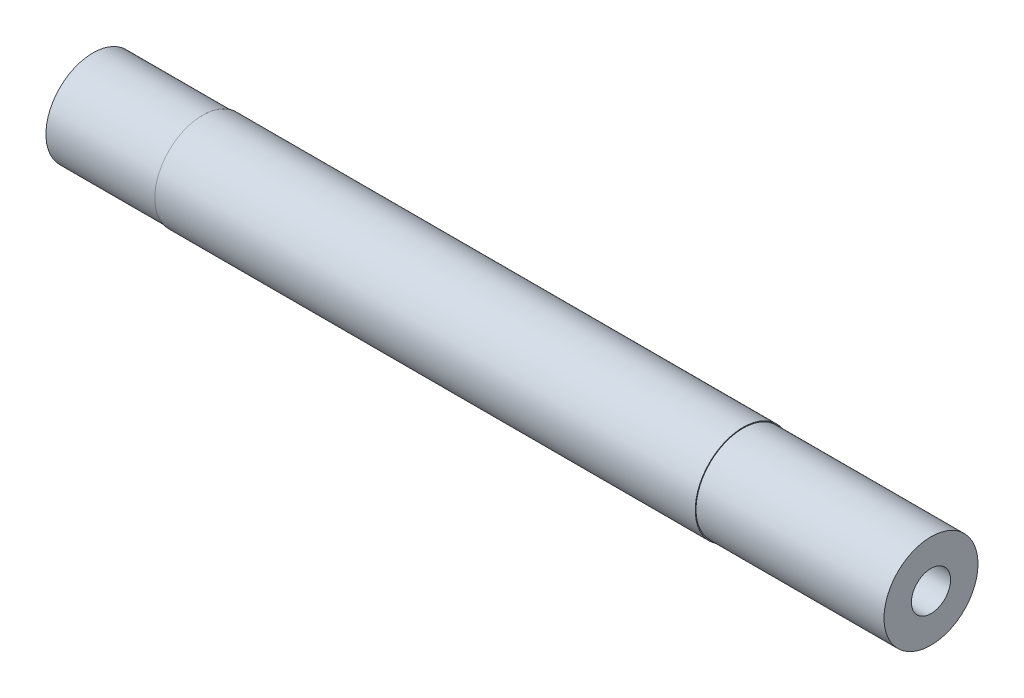
ISO-10303-21;
HEADER;
FILE_DESCRIPTION(('STEP AP214'),'2;1');
FILE_NAME('part.step','',(''),(''),'','','');
FILE_SCHEMA(('AUTOMOTIVE_DESIGN { 1 0 10303 214 1 1 1 1 }'));
ENDSEC;
DATA;
#1=APPLICATION_CONTEXT('core data for automotive mechanical design processes');
#2=APPLICATION_PROTOCOL_DEFINITION('international standard','automotive_design',2000,#1);
#3=PRODUCT_CONTEXT('',#1,'mechanical');
#4=PRODUCT('Part','Part','',(#3));
#5=PRODUCT_RELATED_PRODUCT_CATEGORY('part','',(#4));
#6=PRODUCT_DEFINITION_FORMATION('','',#4);
#7=PRODUCT_DEFINITION_CONTEXT('part definition',#1,'design');
#8=PRODUCT_DEFINITION('design','',#6,#7);
#9=PRODUCT_DEFINITION_SHAPE('','',#8);
#10=(LENGTH_UNIT() NAMED_UNIT(*) SI_UNIT(.MILLI.,.METRE.));
#11=(NAMED_UNIT(*) PLANE_ANGLE_UNIT() SI_UNIT($,.RADIAN.));
#12=(NAMED_UNIT(*) SI_UNIT($,.STERADIAN.) SOLID_ANGLE_UNIT());
#13=UNCERTAINTY_MEASURE_WITH_UNIT(LENGTH_MEASURE(1.E-05),#10,'distance_accuracy_value','');
#14=(GEOMETRIC_REPRESENTATION_CONTEXT(3) GLOBAL_UNCERTAINTY_ASSIGNED_CONTEXT((#13)) GLOBAL_UNIT_ASSIGNED_CONTEXT((#10,
#11,#12)) REPRESENTATION_CONTEXT('',''));
#15=CARTESIAN_POINT('',(0.,0.,0.));
#16=DIRECTION('',(0.,0.,1.));
#17=DIRECTION('',(1.,0.,0.));
#18=AXIS2_PLACEMENT_3D('',#15,#16,#17);
#19=CARTESIAN_POINT('',(0.,0.,0.));
#20=DIRECTION('',(-1.,0.,0.));
#21=DIRECTION('',(0.,0.,1.));
#22=AXIS2_PLACEMENT_3D('',#19,#20,#21);
#23=PLANE('',#22);
#24=CARTESIAN_POINT('',(0.,0.,0.));
#25=DIRECTION('',(1.,0.,0.));
#26=DIRECTION('',(0.,0.,-1.));
#27=AXIS2_PLACEMENT_3D('',#24,#25,#26);
#28=CIRCLE('',#27,3.);
#29=CARTESIAN_POINT('',(0.,0.,-3.));
#30=VERTEX_POINT('',#29);
#31=EDGE_CURVE('E10',#30,#30,#28,.T.);
#32=ORIENTED_EDGE('',*,*,#31,.F.);
#33=EDGE_LOOP('',(#32));
#34=FACE_BOUND('',#33,.T.);
#35=ADVANCED_FACE('F35',(#34),#23,.T.);
#36=CARTESIAN_POINT('',(0.,0.,0.));
#37=DIRECTION('',(1.,0.,0.));
#38=DIRECTION('',(0.,0.,-1.));
#39=AXIS2_PLACEMENT_3D('',#36,#37,#38);
#40=CYLINDRICAL_SURFACE('',#39,3.);
#41=ORIENTED_EDGE('',*,*,#31,.T.);
#42=EDGE_LOOP('',(#41));
#43=FACE_BOUND('',#42,.T.);
#44=CARTESIAN_POINT('',(7.,0.,0.));
#45=DIRECTION('',(1.,0.,0.));
#46=DIRECTION('',(0.,0.,-1.));
#47=AXIS2_PLACEMENT_3D('',#44,#45,#46);
#48=CIRCLE('',#47,3.);
#49=CARTESIAN_POINT('',(7.,0.,-3.));
#50=VERTEX_POINT('',#49);
#51=EDGE_CURVE('E41',#50,#50,#48,.T.);
#52=ORIENTED_EDGE('',*,*,#51,.F.);
#53=EDGE_LOOP('',(#52));
#54=FACE_BOUND('',#53,.T.);
#55=ADVANCED_FACE('F93',(#43,#54),#40,.T.);
#56=CARTESIAN_POINT('',(7.,0.,-3.));
#57=DIRECTION('',(-1.,0.,0.));
#58=DIRECTION('',(0.,0.,1.));
#59=AXIS2_PLACEMENT_3D('',#56,#57,#58);
#60=PLANE('',#59);
#61=ORIENTED_EDGE('',*,*,#51,.T.);
#62=EDGE_LOOP('',(#61));
#63=FACE_BOUND('',#62,.T.);
#64=CARTESIAN_POINT('',(7.,0.,0.));
#65=DIRECTION('',(1.,0.,0.));
#66=DIRECTION('',(0.,0.,-1.));
#67=AXIS2_PLACEMENT_3D('',#64,#65,#66);
#68=CIRCLE('',#67,3.05);
#69=CARTESIAN_POINT('',(7.,0.,-3.05));
#70=VERTEX_POINT('',#69);
#71=EDGE_CURVE('E45',#70,#70,#68,.T.);
#72=ORIENTED_EDGE('',*,*,#71,.F.);
#73=EDGE_LOOP('',(#72));
#74=FACE_BOUND('',#73,.T.);
#75=ADVANCED_FACE('F98',(#63,#74),#60,.T.);
#76=CARTESIAN_POINT('',(0.,0.,0.));
#77=DIRECTION('',(1.,0.,0.));
#78=DIRECTION('',(0.,0.,-1.));
#79=AXIS2_PLACEMENT_3D('',#76,#77,#78);
#80=CYLINDRICAL_SURFACE('',#79,3.05);
#81=ORIENTED_EDGE('',*,*,#71,.T.);
#82=EDGE_LOOP('',(#81));
#83=FACE_BOUND('',#82,.T.);
#84=CARTESIAN_POINT('',(41.5,0.,0.));
#85=DIRECTION('',(1.,0.,0.));
#86=DIRECTION('',(0.,0.,-1.));
#87=AXIS2_PLACEMENT_3D('',#84,#85,#86);
#88=CIRCLE('',#87,3.05);
#89=CARTESIAN_POINT('',(41.5,0.,-3.05));
#90=VERTEX_POINT('',#89);
#91=EDGE_CURVE('E49',#90,#90,#88,.T.);
#92=ORIENTED_EDGE('',*,*,#91,.F.);
#93=EDGE_LOOP('',(#92));
#94=FACE_BOUND('',#93,.T.);
#95=ADVANCED_FACE('F89',(#83,#94),#80,.T.);
#96=CARTESIAN_POINT('',(41.5,0.,-3.));
#97=DIRECTION('',(1.,0.,0.));
#98=DIRECTION('',(0.,0.,-1.));
#99=AXIS2_PLACEMENT_3D('',#96,#97,#98);
#100=PLANE('',#99);
#101=ORIENTED_EDGE('',*,*,#91,.T.);
#102=EDGE_LOOP('',(#101));
#103=FACE_BOUND('',#102,.T.);
#104=CARTESIAN_POINT('',(41.5,0.,0.));
#105=DIRECTION('',(1.,0.,0.));
#106=DIRECTION('',(0.,0.,-1.));
#107=AXIS2_PLACEMENT_3D('',#104,#105,#106);
#108=CIRCLE('',#107,3.);
#109=CARTESIAN_POINT('',(41.5,0.,-3.));
#110=VERTEX_POINT('',#109);
#111=EDGE_CURVE('E54',#110,#110,#108,.T.);
#112=ORIENTED_EDGE('',*,*,#111,.F.);
#113=EDGE_LOOP('',(#112));
#114=FACE_BOUND('',#113,.T.);
#115=ADVANCED_FACE('F83',(#103,#114),#100,.T.);
#116=CARTESIAN_POINT('',(0.,0.,0.));
#117=DIRECTION('',(1.,0.,0.));
#118=DIRECTION('',(0.,0.,-1.));
#119=AXIS2_PLACEMENT_3D('',#116,#117,#118);
#120=CYLINDRICAL_SURFACE('',#119,3.);
#121=ORIENTED_EDGE('',*,*,#111,.T.);
#122=EDGE_LOOP('',(#121));
#123=FACE_BOUND('',#122,.T.);
#124=CARTESIAN_POINT('',(53.5,0.,0.));
#125=DIRECTION('',(1.,0.,0.));
#126=DIRECTION('',(0.,0.,-1.));
#127=AXIS2_PLACEMENT_3D('',#124,#125,#126);
#128=CIRCLE('',#127,3.);
#129=CARTESIAN_POINT('',(53.5,0.,-3.));
#130=VERTEX_POINT('',#129);
#131=EDGE_CURVE('E57',#130,#130,#128,.T.);
#132=ORIENTED_EDGE('',*,*,#131,.F.);
#133=EDGE_LOOP('',(#132));
#134=FACE_BOUND('',#133,.T.);
#135=ADVANCED_FACE('F78',(#123,#134),#120,.T.);
#136=CARTESIAN_POINT('',(53.5,0.,0.));
#137=DIRECTION('',(1.,0.,0.));
#138=DIRECTION('',(0.,0.,-1.));
#139=AXIS2_PLACEMENT_3D('',#136,#137,#138);
#140=PLANE('',#139);
#141=CARTESIAN_POINT('',(53.5,0.,0.));
#142=DIRECTION('',(1.,0.,0.));
#143=DIRECTION('',(0.,0.,-1.));
#144=AXIS2_PLACEMENT_3D('',#141,#142,#143);
#145=CIRCLE('',#144,1.25);
#146=CARTESIAN_POINT('',(53.5,0.,-1.25));
#147=VERTEX_POINT('',#146);
#148=EDGE_CURVE('E61',#147,#147,#145,.T.);
#149=ORIENTED_EDGE('',*,*,#148,.F.);
#150=EDGE_LOOP('',(#149));
#151=FACE_BOUND('',#150,.T.);
#152=ORIENTED_EDGE('',*,*,#131,.T.);
#153=EDGE_LOOP('',(#152));
#154=FACE_BOUND('',#153,.T.);
#155=ADVANCED_FACE('F72',(#151,#154),#140,.T.);
#156=CARTESIAN_POINT('',(43.5,0.,0.));
#157=DIRECTION('',(1.,0.,0.));
#158=DIRECTION('',(0.,0.,-1.));
#159=AXIS2_PLACEMENT_3D('',#156,#157,#158);
#160=CYLINDRICAL_SURFACE('',#159,1.25);
#161=CARTESIAN_POINT('',(43.5,0.,0.));
#162=DIRECTION('',(1.,0.,0.));
#163=DIRECTION('',(0.,0.,-1.));
#164=AXIS2_PLACEMENT_3D('',#161,#162,#163);
#165=CIRCLE('',#164,1.25);
#166=CARTESIAN_POINT('',(43.5,0.,-1.25));
#167=VERTEX_POINT('',#166);
#168=EDGE_CURVE('E60',#167,#167,#165,.T.);
#169=ORIENTED_EDGE('',*,*,#168,.F.);
#170=EDGE_LOOP('',(#169));
#171=FACE_BOUND('',#170,.T.);
#172=ORIENTED_EDGE('',*,*,#148,.T.);
#173=EDGE_LOOP('',(#172));
#174=FACE_BOUND('',#173,.T.);
#175=ADVANCED_FACE('F69',(#171,#174),#160,.F.);
#176=CARTESIAN_POINT('',(43.5,0.,0.));
#177=DIRECTION('',(1.,0.,0.));
#178=DIRECTION('',(0.,0.,-1.));
#179=AXIS2_PLACEMENT_3D('',#176,#177,#178);
#180=PLANE('',#179);
#181=ORIENTED_EDGE('',*,*,#168,.T.);
#182=EDGE_LOOP('',(#181));
#183=FACE_BOUND('',#182,.T.);
#184=ADVANCED_FACE('F67',(#183),#180,.T.);
#185=CLOSED_SHELL('',(#35,#55,#75,#95,#115,#135,#155,#175,#184));
#186=MANIFOLD_SOLID_BREP('B2',#185);
#187=ADVANCED_BREP_SHAPE_REPRESENTATION('',(#18,#186),#14);
#188=SHAPE_DEFINITION_REPRESENTATION(#9,#187);
ENDSEC;
END-ISO-10303-21;
